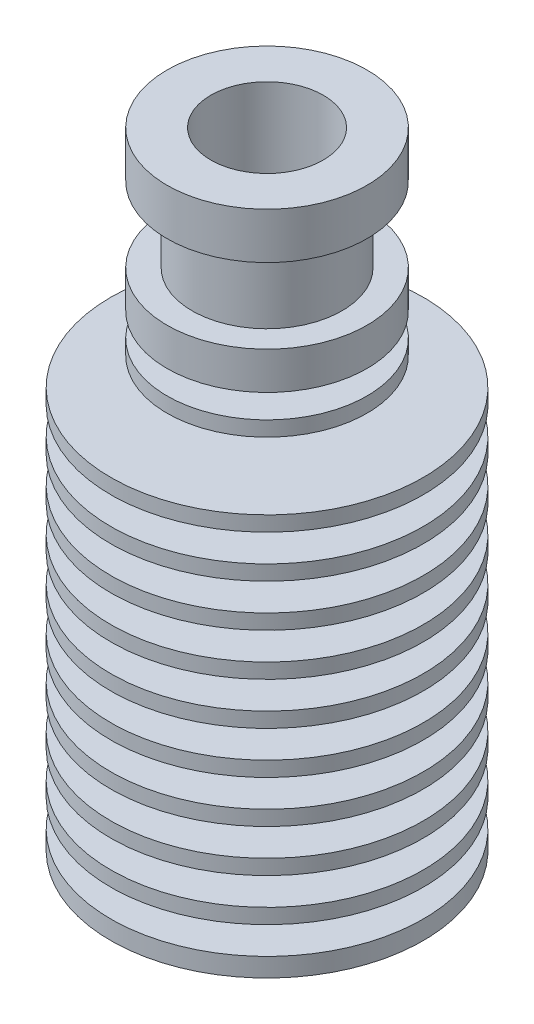
ISO-10303-21;
HEADER;
FILE_DESCRIPTION(('STEP AP214'),'2;1');
FILE_NAME('part.step','',(''),(''),'','','');
FILE_SCHEMA(('AUTOMOTIVE_DESIGN { 1 0 10303 214 1 1 1 1 }'));
ENDSEC;
DATA;
#1=APPLICATION_CONTEXT('core data for automotive mechanical design processes');
#2=APPLICATION_PROTOCOL_DEFINITION('international standard','automotive_design',2000,#1);
#3=PRODUCT_CONTEXT('',#1,'mechanical');
#4=PRODUCT('Part','Part','',(#3));
#5=PRODUCT_RELATED_PRODUCT_CATEGORY('part','',(#4));
#6=PRODUCT_DEFINITION_FORMATION('','',#4);
#7=PRODUCT_DEFINITION_CONTEXT('part definition',#1,'design');
#8=PRODUCT_DEFINITION('design','',#6,#7);
#9=PRODUCT_DEFINITION_SHAPE('','',#8);
#10=(LENGTH_UNIT() NAMED_UNIT(*) SI_UNIT(.MILLI.,.METRE.));
#11=(NAMED_UNIT(*) PLANE_ANGLE_UNIT() SI_UNIT($,.RADIAN.));
#12=(NAMED_UNIT(*) SI_UNIT($,.STERADIAN.) SOLID_ANGLE_UNIT());
#13=UNCERTAINTY_MEASURE_WITH_UNIT(LENGTH_MEASURE(1.E-05),#10,'distance_accuracy_value','');
#14=(GEOMETRIC_REPRESENTATION_CONTEXT(3) GLOBAL_UNCERTAINTY_ASSIGNED_CONTEXT((#13)) GLOBAL_UNIT_ASSIGNED_CONTEXT((#10,
#11,#12)) REPRESENTATION_CONTEXT('',''));
#15=CARTESIAN_POINT('',(0.,0.,0.));
#16=DIRECTION('',(0.,0.,1.));
#17=DIRECTION('',(1.,0.,0.));
#18=AXIS2_PLACEMENT_3D('',#15,#16,#17);
#19=CARTESIAN_POINT('',(0.,64.6374556213018,0.));
#20=DIRECTION('',(0.,1.,0.));
#21=DIRECTION('',(-1.,0.,0.));
#22=AXIS2_PLACEMENT_3D('',#19,#20,#21);
#23=CYLINDRICAL_SURFACE('',#22,8.);
#24=CARTESIAN_POINT('',(0.,54.9374556213018,0.));
#25=DIRECTION('',(0.,1.,0.));
#26=DIRECTION('',(-1.,0.,0.));
#27=AXIS2_PLACEMENT_3D('',#24,#25,#26);
#28=CIRCLE('',#27,8.);
#29=CARTESIAN_POINT('',(-8.,54.9374556213018,0.));
#30=VERTEX_POINT('',#29);
#31=EDGE_CURVE('E213',#30,#30,#28,.T.);
#32=ORIENTED_EDGE('',*,*,#31,.F.);
#33=EDGE_LOOP('',(#32));
#34=FACE_BOUND('',#33,.T.);
#35=CARTESIAN_POINT('',(0.,51.9374556213018,0.));
#36=DIRECTION('',(0.,1.,0.));
#37=DIRECTION('',(-1.,0.,0.));
#38=AXIS2_PLACEMENT_3D('',#35,#36,#37);
#39=CIRCLE('',#38,8.);
#40=CARTESIAN_POINT('',(-7.99999999999999,51.9374556213018,0.));
#41=VERTEX_POINT('',#40);
#42=EDGE_CURVE('E12',#41,#41,#39,.T.);
#43=ORIENTED_EDGE('',*,*,#42,.T.);
#44=EDGE_LOOP('',(#43));
#45=FACE_BOUND('',#44,.T.);
#46=ADVANCED_FACE('F41',(#34,#45),#23,.T.);
#47=CARTESIAN_POINT('',(8.,51.9374556213018,0.));
#48=DIRECTION('',(0.,1.,0.));
#49=DIRECTION('',(-1.,0.,0.));
#50=AXIS2_PLACEMENT_3D('',#47,#48,#49);
#51=PLANE('',#50);
#52=ORIENTED_EDGE('',*,*,#42,.F.);
#53=EDGE_LOOP('',(#52));
#54=FACE_BOUND('',#53,.T.);
#55=CARTESIAN_POINT('',(0.,51.9374556213018,0.));
#56=DIRECTION('',(0.,1.,0.));
#57=DIRECTION('',(-1.,0.,0.));
#58=AXIS2_PLACEMENT_3D('',#55,#56,#57);
#59=CIRCLE('',#58,4.5);
#60=CARTESIAN_POINT('',(-4.49999999999999,51.9374556213018,0.));
#61=VERTEX_POINT('',#60);
#62=EDGE_CURVE('E47',#61,#61,#59,.T.);
#63=ORIENTED_EDGE('',*,*,#62,.T.);
#64=EDGE_LOOP('',(#63));
#65=FACE_BOUND('',#64,.T.);
#66=ADVANCED_FACE('F220',(#54,#65),#51,.F.);
#67=CARTESIAN_POINT('',(0.,64.6374556213018,0.));
#68=DIRECTION('',(0.,1.,0.));
#69=DIRECTION('',(-1.,0.,0.));
#70=AXIS2_PLACEMENT_3D('',#67,#68,#69);
#71=CYLINDRICAL_SURFACE('',#70,4.5);
#72=ORIENTED_EDGE('',*,*,#62,.F.);
#73=EDGE_LOOP('',(#72));
#74=FACE_BOUND('',#73,.T.);
#75=CARTESIAN_POINT('',(0.,50.0374556213018,0.));
#76=DIRECTION('',(0.,1.,0.));
#77=DIRECTION('',(-1.,0.,0.));
#78=AXIS2_PLACEMENT_3D('',#75,#76,#77);
#79=CIRCLE('',#78,4.5);
#80=CARTESIAN_POINT('',(-4.49999999999999,50.0374556213018,0.));
#81=VERTEX_POINT('',#80);
#82=EDGE_CURVE('E51',#81,#81,#79,.T.);
#83=ORIENTED_EDGE('',*,*,#82,.T.);
#84=EDGE_LOOP('',(#83));
#85=FACE_BOUND('',#84,.T.);
#86=ADVANCED_FACE('F224',(#74,#85),#71,.T.);
#87=CARTESIAN_POINT('',(4.5,50.0374556213018,0.));
#88=DIRECTION('',(0.,-1.,0.));
#89=DIRECTION('',(1.,0.,0.));
#90=AXIS2_PLACEMENT_3D('',#87,#88,#89);
#91=PLANE('',#90);
#92=ORIENTED_EDGE('',*,*,#82,.F.);
#93=EDGE_LOOP('',(#92));
#94=FACE_BOUND('',#93,.T.);
#95=CARTESIAN_POINT('',(0.,50.0374556213018,0.));
#96=DIRECTION('',(0.,1.,0.));
#97=DIRECTION('',(-1.,0.,0.));
#98=AXIS2_PLACEMENT_3D('',#95,#96,#97);
#99=CIRCLE('',#98,8.);
#100=CARTESIAN_POINT('',(-7.99999999999999,50.0374556213018,0.));
#101=VERTEX_POINT('',#100);
#102=EDGE_CURVE('E55',#101,#101,#99,.T.);
#103=ORIENTED_EDGE('',*,*,#102,.T.);
#104=EDGE_LOOP('',(#103));
#105=FACE_BOUND('',#104,.T.);
#106=ADVANCED_FACE('F229',(#94,#105),#91,.F.);
#107=CARTESIAN_POINT('',(0.,64.6374556213018,0.));
#108=DIRECTION('',(0.,1.,0.));
#109=DIRECTION('',(-1.,0.,0.));
#110=AXIS2_PLACEMENT_3D('',#107,#108,#109);
#111=CYLINDRICAL_SURFACE('',#110,8.);
#112=ORIENTED_EDGE('',*,*,#102,.F.);
#113=EDGE_LOOP('',(#112));
#114=FACE_BOUND('',#113,.T.);
#115=CARTESIAN_POINT('',(0.,48.8374556213018,0.));
#116=DIRECTION('',(0.,1.,0.));
#117=DIRECTION('',(-1.,0.,0.));
#118=AXIS2_PLACEMENT_3D('',#115,#116,#117);
#119=CIRCLE('',#118,8.);
#120=CARTESIAN_POINT('',(-7.99999999999999,48.8374556213018,0.));
#121=VERTEX_POINT('',#120);
#122=EDGE_CURVE('E60',#121,#121,#119,.T.);
#123=ORIENTED_EDGE('',*,*,#122,.T.);
#124=EDGE_LOOP('',(#123));
#125=FACE_BOUND('',#124,.T.);
#126=ADVANCED_FACE('F235',(#114,#125),#111,.T.);
#127=CARTESIAN_POINT('',(8.,48.8374556213018,0.));
#128=DIRECTION('',(0.,1.,0.));
#129=DIRECTION('',(-1.,0.,0.));
#130=AXIS2_PLACEMENT_3D('',#127,#128,#129);
#131=PLANE('',#130);
#132=ORIENTED_EDGE('',*,*,#122,.F.);
#133=EDGE_LOOP('',(#132));
#134=FACE_BOUND('',#133,.T.);
#135=CARTESIAN_POINT('',(0.,48.8374556213018,0.));
#136=DIRECTION('',(0.,1.,0.));
#137=DIRECTION('',(-1.,0.,0.));
#138=AXIS2_PLACEMENT_3D('',#135,#136,#137);
#139=CIRCLE('',#138,4.);
#140=CARTESIAN_POINT('',(-4.,48.8374556213018,0.));
#141=VERTEX_POINT('',#140);
#142=EDGE_CURVE('E63',#141,#141,#139,.T.);
#143=ORIENTED_EDGE('',*,*,#142,.T.);
#144=EDGE_LOOP('',(#143));
#145=FACE_BOUND('',#144,.T.);
#146=ADVANCED_FACE('F239',(#134,#145),#131,.F.);
#147=CARTESIAN_POINT('',(0.,64.6374556213018,0.));
#148=DIRECTION('',(0.,1.,0.));
#149=DIRECTION('',(-1.,0.,0.));
#150=AXIS2_PLACEMENT_3D('',#147,#148,#149);
#151=CYLINDRICAL_SURFACE('',#150,4.);
#152=ORIENTED_EDGE('',*,*,#142,.F.);
#153=EDGE_LOOP('',(#152));
#154=FACE_BOUND('',#153,.T.);
#155=CARTESIAN_POINT('',(0.,46.6374556213018,0.));
#156=DIRECTION('',(0.,1.,0.));
#157=DIRECTION('',(-1.,0.,0.));
#158=AXIS2_PLACEMENT_3D('',#155,#156,#157);
#159=CIRCLE('',#158,4.);
#160=CARTESIAN_POINT('',(-3.99999999999999,46.6374556213018,0.));
#161=VERTEX_POINT('',#160);
#162=EDGE_CURVE('E66',#161,#161,#159,.T.);
#163=ORIENTED_EDGE('',*,*,#162,.T.);
#164=EDGE_LOOP('',(#163));
#165=FACE_BOUND('',#164,.T.);
#166=ADVANCED_FACE('F243',(#154,#165),#151,.T.);
#167=CARTESIAN_POINT('',(4.,46.6374556213018,0.));
#168=DIRECTION('',(0.,-1.,0.));
#169=DIRECTION('',(1.,0.,0.));
#170=AXIS2_PLACEMENT_3D('',#167,#168,#169);
#171=PLANE('',#170);
#172=ORIENTED_EDGE('',*,*,#162,.F.);
#173=EDGE_LOOP('',(#172));
#174=FACE_BOUND('',#173,.T.);
#175=CARTESIAN_POINT('',(0.,46.6374556213018,0.));
#176=DIRECTION('',(0.,1.,0.));
#177=DIRECTION('',(-1.,0.,0.));
#178=AXIS2_PLACEMENT_3D('',#175,#176,#177);
#179=CIRCLE('',#178,12.5);
#180=CARTESIAN_POINT('',(-12.5,46.6374556213018,0.));
#181=VERTEX_POINT('',#180);
#182=EDGE_CURVE('E69',#181,#181,#179,.T.);
#183=ORIENTED_EDGE('',*,*,#182,.T.);
#184=EDGE_LOOP('',(#183));
#185=FACE_BOUND('',#184,.T.);
#186=ADVANCED_FACE('F247',(#174,#185),#171,.F.);
#187=CARTESIAN_POINT('',(0.,64.6374556213018,0.));
#188=DIRECTION('',(0.,1.,0.));
#189=DIRECTION('',(-1.,0.,0.));
#190=AXIS2_PLACEMENT_3D('',#187,#188,#189);
#191=CYLINDRICAL_SURFACE('',#190,12.5);
#192=ORIENTED_EDGE('',*,*,#182,.F.);
#193=EDGE_LOOP('',(#192));
#194=FACE_BOUND('',#193,.T.);
#195=CARTESIAN_POINT('',(0.,45.4374556213018,0.));
#196=DIRECTION('',(0.,1.,0.));
#197=DIRECTION('',(-1.,0.,0.));
#198=AXIS2_PLACEMENT_3D('',#195,#196,#197);
#199=CIRCLE('',#198,12.5);
#200=CARTESIAN_POINT('',(-12.5,45.4374556213018,0.));
#201=VERTEX_POINT('',#200);
#202=EDGE_CURVE('E72',#201,#201,#199,.T.);
#203=ORIENTED_EDGE('',*,*,#202,.T.);
#204=EDGE_LOOP('',(#203));
#205=FACE_BOUND('',#204,.T.);
#206=ADVANCED_FACE('F251',(#194,#205),#191,.T.);
#207=CARTESIAN_POINT('',(12.5,45.4374556213018,0.));
#208=DIRECTION('',(0.,1.,0.));
#209=DIRECTION('',(-1.,0.,0.));
#210=AXIS2_PLACEMENT_3D('',#207,#208,#209);
#211=PLANE('',#210);
#212=ORIENTED_EDGE('',*,*,#202,.F.);
#213=EDGE_LOOP('',(#212));
#214=FACE_BOUND('',#213,.T.);
#215=CARTESIAN_POINT('',(0.,45.4374556213018,0.));
#216=DIRECTION('',(0.,1.,0.));
#217=DIRECTION('',(-1.,0.,0.));
#218=AXIS2_PLACEMENT_3D('',#215,#216,#217);
#219=CIRCLE('',#218,4.);
#220=CARTESIAN_POINT('',(-3.99999999999999,45.4374556213018,0.));
#221=VERTEX_POINT('',#220);
#222=EDGE_CURVE('E75',#221,#221,#219,.T.);
#223=ORIENTED_EDGE('',*,*,#222,.T.);
#224=EDGE_LOOP('',(#223));
#225=FACE_BOUND('',#224,.T.);
#226=ADVANCED_FACE('F255',(#214,#225),#211,.F.);
#227=CARTESIAN_POINT('',(0.,64.6374556213018,0.));
#228=DIRECTION('',(0.,1.,0.));
#229=DIRECTION('',(-1.,0.,0.));
#230=AXIS2_PLACEMENT_3D('',#227,#228,#229);
#231=CYLINDRICAL_SURFACE('',#230,4.);
#232=ORIENTED_EDGE('',*,*,#222,.F.);
#233=EDGE_LOOP('',(#232));
#234=FACE_BOUND('',#233,.T.);
#235=CARTESIAN_POINT('',(0.,43.2374556213018,0.));
#236=DIRECTION('',(0.,1.,0.));
#237=DIRECTION('',(-1.,0.,0.));
#238=AXIS2_PLACEMENT_3D('',#235,#236,#237);
#239=CIRCLE('',#238,4.);
#240=CARTESIAN_POINT('',(-3.99999999999999,43.2374556213018,0.));
#241=VERTEX_POINT('',#240);
#242=EDGE_CURVE('E78',#241,#241,#239,.T.);
#243=ORIENTED_EDGE('',*,*,#242,.T.);
#244=EDGE_LOOP('',(#243));
#245=FACE_BOUND('',#244,.T.);
#246=ADVANCED_FACE('F259',(#234,#245),#231,.T.);
#247=CARTESIAN_POINT('',(4.,43.2374556213018,0.));
#248=DIRECTION('',(0.,-1.,0.));
#249=DIRECTION('',(1.,0.,0.));
#250=AXIS2_PLACEMENT_3D('',#247,#248,#249);
#251=PLANE('',#250);
#252=ORIENTED_EDGE('',*,*,#242,.F.);
#253=EDGE_LOOP('',(#252));
#254=FACE_BOUND('',#253,.T.);
#255=CARTESIAN_POINT('',(0.,43.2374556213018,0.));
#256=DIRECTION('',(0.,1.,0.));
#257=DIRECTION('',(-1.,0.,0.));
#258=AXIS2_PLACEMENT_3D('',#255,#256,#257);
#259=CIRCLE('',#258,12.5);
#260=CARTESIAN_POINT('',(-12.5,43.2374556213018,0.));
#261=VERTEX_POINT('',#260);
#262=EDGE_CURVE('E81',#261,#261,#259,.T.);
#263=ORIENTED_EDGE('',*,*,#262,.T.);
#264=EDGE_LOOP('',(#263));
#265=FACE_BOUND('',#264,.T.);
#266=ADVANCED_FACE('F263',(#254,#265),#251,.F.);
#267=CARTESIAN_POINT('',(0.,64.6374556213018,0.));
#268=DIRECTION('',(0.,1.,0.));
#269=DIRECTION('',(-1.,0.,0.));
#270=AXIS2_PLACEMENT_3D('',#267,#268,#269);
#271=CYLINDRICAL_SURFACE('',#270,12.5);
#272=ORIENTED_EDGE('',*,*,#262,.F.);
#273=EDGE_LOOP('',(#272));
#274=FACE_BOUND('',#273,.T.);
#275=CARTESIAN_POINT('',(0.,42.0374556213018,0.));
#276=DIRECTION('',(0.,1.,0.));
#277=DIRECTION('',(-1.,0.,0.));
#278=AXIS2_PLACEMENT_3D('',#275,#276,#277);
#279=CIRCLE('',#278,12.5);
#280=CARTESIAN_POINT('',(-12.5,42.0374556213018,0.));
#281=VERTEX_POINT('',#280);
#282=EDGE_CURVE('E84',#281,#281,#279,.T.);
#283=ORIENTED_EDGE('',*,*,#282,.T.);
#284=EDGE_LOOP('',(#283));
#285=FACE_BOUND('',#284,.T.);
#286=ADVANCED_FACE('F267',(#274,#285),#271,.T.);
#287=CARTESIAN_POINT('',(12.5,42.0374556213018,0.));
#288=DIRECTION('',(0.,1.,0.));
#289=DIRECTION('',(-1.,0.,0.));
#290=AXIS2_PLACEMENT_3D('',#287,#288,#289);
#291=PLANE('',#290);
#292=ORIENTED_EDGE('',*,*,#282,.F.);
#293=EDGE_LOOP('',(#292));
#294=FACE_BOUND('',#293,.T.);
#295=CARTESIAN_POINT('',(0.,42.0374556213018,0.));
#296=DIRECTION('',(0.,1.,0.));
#297=DIRECTION('',(-1.,0.,0.));
#298=AXIS2_PLACEMENT_3D('',#295,#296,#297);
#299=CIRCLE('',#298,4.);
#300=CARTESIAN_POINT('',(-3.99999999999999,42.0374556213018,0.));
#301=VERTEX_POINT('',#300);
#302=EDGE_CURVE('E87',#301,#301,#299,.T.);
#303=ORIENTED_EDGE('',*,*,#302,.T.);
#304=EDGE_LOOP('',(#303));
#305=FACE_BOUND('',#304,.T.);
#306=ADVANCED_FACE('F271',(#294,#305),#291,.F.);
#307=CARTESIAN_POINT('',(0.,64.6374556213018,0.));
#308=DIRECTION('',(0.,1.,0.));
#309=DIRECTION('',(-1.,0.,0.));
#310=AXIS2_PLACEMENT_3D('',#307,#308,#309);
#311=CYLINDRICAL_SURFACE('',#310,4.);
#312=ORIENTED_EDGE('',*,*,#302,.F.);
#313=EDGE_LOOP('',(#312));
#314=FACE_BOUND('',#313,.T.);
#315=CARTESIAN_POINT('',(0.,39.8374556213018,0.));
#316=DIRECTION('',(0.,1.,0.));
#317=DIRECTION('',(-1.,0.,0.));
#318=AXIS2_PLACEMENT_3D('',#315,#316,#317);
#319=CIRCLE('',#318,4.);
#320=CARTESIAN_POINT('',(-3.99999999999999,39.8374556213018,0.));
#321=VERTEX_POINT('',#320);
#322=EDGE_CURVE('E90',#321,#321,#319,.T.);
#323=ORIENTED_EDGE('',*,*,#322,.T.);
#324=EDGE_LOOP('',(#323));
#325=FACE_BOUND('',#324,.T.);
#326=ADVANCED_FACE('F275',(#314,#325),#311,.T.);
#327=CARTESIAN_POINT('',(4.,39.8374556213018,0.));
#328=DIRECTION('',(0.,-1.,0.));
#329=DIRECTION('',(1.,0.,0.));
#330=AXIS2_PLACEMENT_3D('',#327,#328,#329);
#331=PLANE('',#330);
#332=ORIENTED_EDGE('',*,*,#322,.F.);
#333=EDGE_LOOP('',(#332));
#334=FACE_BOUND('',#333,.T.);
#335=CARTESIAN_POINT('',(0.,39.8374556213018,0.));
#336=DIRECTION('',(0.,1.,0.));
#337=DIRECTION('',(-1.,0.,0.));
#338=AXIS2_PLACEMENT_3D('',#335,#336,#337);
#339=CIRCLE('',#338,12.5);
#340=CARTESIAN_POINT('',(-12.5,39.8374556213018,0.));
#341=VERTEX_POINT('',#340);
#342=EDGE_CURVE('E93',#341,#341,#339,.T.);
#343=ORIENTED_EDGE('',*,*,#342,.T.);
#344=EDGE_LOOP('',(#343));
#345=FACE_BOUND('',#344,.T.);
#346=ADVANCED_FACE('F279',(#334,#345),#331,.F.);
#347=CARTESIAN_POINT('',(0.,64.6374556213018,0.));
#348=DIRECTION('',(0.,1.,0.));
#349=DIRECTION('',(-1.,0.,0.));
#350=AXIS2_PLACEMENT_3D('',#347,#348,#349);
#351=CYLINDRICAL_SURFACE('',#350,12.5);
#352=ORIENTED_EDGE('',*,*,#342,.F.);
#353=EDGE_LOOP('',(#352));
#354=FACE_BOUND('',#353,.T.);
#355=CARTESIAN_POINT('',(0.,38.6374556213018,0.));
#356=DIRECTION('',(0.,1.,0.));
#357=DIRECTION('',(-1.,0.,0.));
#358=AXIS2_PLACEMENT_3D('',#355,#356,#357);
#359=CIRCLE('',#358,12.5);
#360=CARTESIAN_POINT('',(-12.5,38.6374556213018,0.));
#361=VERTEX_POINT('',#360);
#362=EDGE_CURVE('E96',#361,#361,#359,.T.);
#363=ORIENTED_EDGE('',*,*,#362,.T.);
#364=EDGE_LOOP('',(#363));
#365=FACE_BOUND('',#364,.T.);
#366=ADVANCED_FACE('F283',(#354,#365),#351,.T.);
#367=CARTESIAN_POINT('',(12.5,38.6374556213018,0.));
#368=DIRECTION('',(0.,1.,0.));
#369=DIRECTION('',(-1.,0.,0.));
#370=AXIS2_PLACEMENT_3D('',#367,#368,#369);
#371=PLANE('',#370);
#372=ORIENTED_EDGE('',*,*,#362,.F.);
#373=EDGE_LOOP('',(#372));
#374=FACE_BOUND('',#373,.T.);
#375=CARTESIAN_POINT('',(0.,38.6374556213018,0.));
#376=DIRECTION('',(0.,1.,0.));
#377=DIRECTION('',(-1.,0.,0.));
#378=AXIS2_PLACEMENT_3D('',#375,#376,#377);
#379=CIRCLE('',#378,4.);
#380=CARTESIAN_POINT('',(-3.99999999999999,38.6374556213018,0.));
#381=VERTEX_POINT('',#380);
#382=EDGE_CURVE('E99',#381,#381,#379,.T.);
#383=ORIENTED_EDGE('',*,*,#382,.T.);
#384=EDGE_LOOP('',(#383));
#385=FACE_BOUND('',#384,.T.);
#386=ADVANCED_FACE('F287',(#374,#385),#371,.F.);
#387=CARTESIAN_POINT('',(0.,64.6374556213018,0.));
#388=DIRECTION('',(0.,1.,0.));
#389=DIRECTION('',(-1.,0.,0.));
#390=AXIS2_PLACEMENT_3D('',#387,#388,#389);
#391=CYLINDRICAL_SURFACE('',#390,4.);
#392=ORIENTED_EDGE('',*,*,#382,.F.);
#393=EDGE_LOOP('',(#392));
#394=FACE_BOUND('',#393,.T.);
#395=CARTESIAN_POINT('',(0.,36.4374556213018,0.));
#396=DIRECTION('',(0.,1.,0.));
#397=DIRECTION('',(-1.,0.,0.));
#398=AXIS2_PLACEMENT_3D('',#395,#396,#397);
#399=CIRCLE('',#398,4.);
#400=CARTESIAN_POINT('',(-3.99999999999999,36.4374556213018,0.));
#401=VERTEX_POINT('',#400);
#402=EDGE_CURVE('E102',#401,#401,#399,.T.);
#403=ORIENTED_EDGE('',*,*,#402,.T.);
#404=EDGE_LOOP('',(#403));
#405=FACE_BOUND('',#404,.T.);
#406=ADVANCED_FACE('F291',(#394,#405),#391,.T.);
#407=CARTESIAN_POINT('',(4.,36.4374556213018,0.));
#408=DIRECTION('',(0.,-1.,0.));
#409=DIRECTION('',(1.,0.,0.));
#410=AXIS2_PLACEMENT_3D('',#407,#408,#409);
#411=PLANE('',#410);
#412=ORIENTED_EDGE('',*,*,#402,.F.);
#413=EDGE_LOOP('',(#412));
#414=FACE_BOUND('',#413,.T.);
#415=CARTESIAN_POINT('',(0.,36.4374556213018,0.));
#416=DIRECTION('',(0.,1.,0.));
#417=DIRECTION('',(-1.,0.,0.));
#418=AXIS2_PLACEMENT_3D('',#415,#416,#417);
#419=CIRCLE('',#418,12.5);
#420=CARTESIAN_POINT('',(-12.5,36.4374556213018,0.));
#421=VERTEX_POINT('',#420);
#422=EDGE_CURVE('E105',#421,#421,#419,.T.);
#423=ORIENTED_EDGE('',*,*,#422,.T.);
#424=EDGE_LOOP('',(#423));
#425=FACE_BOUND('',#424,.T.);
#426=ADVANCED_FACE('F295',(#414,#425),#411,.F.);
#427=CARTESIAN_POINT('',(0.,64.6374556213018,0.));
#428=DIRECTION('',(0.,1.,0.));
#429=DIRECTION('',(-1.,0.,0.));
#430=AXIS2_PLACEMENT_3D('',#427,#428,#429);
#431=CYLINDRICAL_SURFACE('',#430,12.5);
#432=ORIENTED_EDGE('',*,*,#422,.F.);
#433=EDGE_LOOP('',(#432));
#434=FACE_BOUND('',#433,.T.);
#435=CARTESIAN_POINT('',(0.,35.2374556213018,0.));
#436=DIRECTION('',(0.,1.,0.));
#437=DIRECTION('',(-1.,0.,0.));
#438=AXIS2_PLACEMENT_3D('',#435,#436,#437);
#439=CIRCLE('',#438,12.5);
#440=CARTESIAN_POINT('',(-12.5,35.2374556213018,0.));
#441=VERTEX_POINT('',#440);
#442=EDGE_CURVE('E108',#441,#441,#439,.T.);
#443=ORIENTED_EDGE('',*,*,#442,.T.);
#444=EDGE_LOOP('',(#443));
#445=FACE_BOUND('',#444,.T.);
#446=ADVANCED_FACE('F299',(#434,#445),#431,.T.);
#447=CARTESIAN_POINT('',(12.5,35.2374556213018,0.));
#448=DIRECTION('',(0.,1.,0.));
#449=DIRECTION('',(-1.,0.,0.));
#450=AXIS2_PLACEMENT_3D('',#447,#448,#449);
#451=PLANE('',#450);
#452=ORIENTED_EDGE('',*,*,#442,.F.);
#453=EDGE_LOOP('',(#452));
#454=FACE_BOUND('',#453,.T.);
#455=CARTESIAN_POINT('',(0.,35.2374556213018,0.));
#456=DIRECTION('',(0.,1.,0.));
#457=DIRECTION('',(-1.,0.,0.));
#458=AXIS2_PLACEMENT_3D('',#455,#456,#457);
#459=CIRCLE('',#458,6.5);
#460=CARTESIAN_POINT('',(-6.49999999999999,35.2374556213018,0.));
#461=VERTEX_POINT('',#460);
#462=EDGE_CURVE('E111',#461,#461,#459,.T.);
#463=ORIENTED_EDGE('',*,*,#462,.T.);
#464=EDGE_LOOP('',(#463));
#465=FACE_BOUND('',#464,.T.);
#466=ADVANCED_FACE('F303',(#454,#465),#451,.F.);
#467=CARTESIAN_POINT('',(0.,64.6374556213018,0.));
#468=DIRECTION('',(0.,1.,0.));
#469=DIRECTION('',(-1.,0.,0.));
#470=AXIS2_PLACEMENT_3D('',#467,#468,#469);
#471=CYLINDRICAL_SURFACE('',#470,6.5);
#472=ORIENTED_EDGE('',*,*,#462,.F.);
#473=EDGE_LOOP('',(#472));
#474=FACE_BOUND('',#473,.T.);
#475=CARTESIAN_POINT('',(0.,33.0374556213018,0.));
#476=DIRECTION('',(0.,1.,0.));
#477=DIRECTION('',(-1.,0.,0.));
#478=AXIS2_PLACEMENT_3D('',#475,#476,#477);
#479=CIRCLE('',#478,6.5);
#480=CARTESIAN_POINT('',(-6.49999999999999,33.0374556213018,0.));
#481=VERTEX_POINT('',#480);
#482=EDGE_CURVE('E114',#481,#481,#479,.T.);
#483=ORIENTED_EDGE('',*,*,#482,.T.);
#484=EDGE_LOOP('',(#483));
#485=FACE_BOUND('',#484,.T.);
#486=ADVANCED_FACE('F307',(#474,#485),#471,.T.);
#487=CARTESIAN_POINT('',(6.5,33.0374556213018,0.));
#488=DIRECTION('',(0.,-1.,0.));
#489=DIRECTION('',(1.,0.,0.));
#490=AXIS2_PLACEMENT_3D('',#487,#488,#489);
#491=PLANE('',#490);
#492=ORIENTED_EDGE('',*,*,#482,.F.);
#493=EDGE_LOOP('',(#492));
#494=FACE_BOUND('',#493,.T.);
#495=CARTESIAN_POINT('',(0.,33.0374556213018,0.));
#496=DIRECTION('',(0.,1.,0.));
#497=DIRECTION('',(-1.,0.,0.));
#498=AXIS2_PLACEMENT_3D('',#495,#496,#497);
#499=CIRCLE('',#498,12.5);
#500=CARTESIAN_POINT('',(-12.5,33.0374556213018,0.));
#501=VERTEX_POINT('',#500);
#502=EDGE_CURVE('E117',#501,#501,#499,.T.);
#503=ORIENTED_EDGE('',*,*,#502,.T.);
#504=EDGE_LOOP('',(#503));
#505=FACE_BOUND('',#504,.T.);
#506=ADVANCED_FACE('F311',(#494,#505),#491,.F.);
#507=CARTESIAN_POINT('',(0.,64.6374556213018,0.));
#508=DIRECTION('',(0.,1.,0.));
#509=DIRECTION('',(-1.,0.,0.));
#510=AXIS2_PLACEMENT_3D('',#507,#508,#509);
#511=CYLINDRICAL_SURFACE('',#510,12.5);
#512=ORIENTED_EDGE('',*,*,#502,.F.);
#513=EDGE_LOOP('',(#512));
#514=FACE_BOUND('',#513,.T.);
#515=CARTESIAN_POINT('',(0.,31.8374556213018,0.));
#516=DIRECTION('',(0.,1.,0.));
#517=DIRECTION('',(-1.,0.,0.));
#518=AXIS2_PLACEMENT_3D('',#515,#516,#517);
#519=CIRCLE('',#518,12.5);
#520=CARTESIAN_POINT('',(-12.5,31.8374556213018,0.));
#521=VERTEX_POINT('',#520);
#522=EDGE_CURVE('E120',#521,#521,#519,.T.);
#523=ORIENTED_EDGE('',*,*,#522,.T.);
#524=EDGE_LOOP('',(#523));
#525=FACE_BOUND('',#524,.T.);
#526=ADVANCED_FACE('F315',(#514,#525),#511,.T.);
#527=CARTESIAN_POINT('',(12.5,31.8374556213018,0.));
#528=DIRECTION('',(0.,1.,0.));
#529=DIRECTION('',(-1.,0.,0.));
#530=AXIS2_PLACEMENT_3D('',#527,#528,#529);
#531=PLANE('',#530);
#532=ORIENTED_EDGE('',*,*,#522,.F.);
#533=EDGE_LOOP('',(#532));
#534=FACE_BOUND('',#533,.T.);
#535=CARTESIAN_POINT('',(0.,31.8374556213018,0.));
#536=DIRECTION('',(0.,1.,0.));
#537=DIRECTION('',(-1.,0.,0.));
#538=AXIS2_PLACEMENT_3D('',#535,#536,#537);
#539=CIRCLE('',#538,7.5);
#540=CARTESIAN_POINT('',(-7.49999999999999,31.8374556213018,0.));
#541=VERTEX_POINT('',#540);
#542=EDGE_CURVE('E123',#541,#541,#539,.T.);
#543=ORIENTED_EDGE('',*,*,#542,.T.);
#544=EDGE_LOOP('',(#543));
#545=FACE_BOUND('',#544,.T.);
#546=ADVANCED_FACE('F319',(#534,#545),#531,.F.);
#547=CARTESIAN_POINT('',(0.,64.6374556213018,0.));
#548=DIRECTION('',(0.,1.,0.));
#549=DIRECTION('',(-1.,0.,0.));
#550=AXIS2_PLACEMENT_3D('',#547,#548,#549);
#551=CYLINDRICAL_SURFACE('',#550,7.5);
#552=ORIENTED_EDGE('',*,*,#542,.F.);
#553=EDGE_LOOP('',(#552));
#554=FACE_BOUND('',#553,.T.);
#555=CARTESIAN_POINT('',(0.,29.6374556213018,0.));
#556=DIRECTION('',(0.,1.,0.));
#557=DIRECTION('',(-1.,0.,0.));
#558=AXIS2_PLACEMENT_3D('',#555,#556,#557);
#559=CIRCLE('',#558,7.5);
#560=CARTESIAN_POINT('',(-7.49999999999999,29.6374556213018,0.));
#561=VERTEX_POINT('',#560);
#562=EDGE_CURVE('E126',#561,#561,#559,.T.);
#563=ORIENTED_EDGE('',*,*,#562,.T.);
#564=EDGE_LOOP('',(#563));
#565=FACE_BOUND('',#564,.T.);
#566=ADVANCED_FACE('F323',(#554,#565),#551,.T.);
#567=CARTESIAN_POINT('',(7.5,29.6374556213018,0.));
#568=DIRECTION('',(0.,-1.,0.));
#569=DIRECTION('',(1.,0.,0.));
#570=AXIS2_PLACEMENT_3D('',#567,#568,#569);
#571=PLANE('',#570);
#572=ORIENTED_EDGE('',*,*,#562,.F.);
#573=EDGE_LOOP('',(#572));
#574=FACE_BOUND('',#573,.T.);
#575=CARTESIAN_POINT('',(0.,29.6374556213018,0.));
#576=DIRECTION('',(0.,1.,0.));
#577=DIRECTION('',(-1.,0.,0.));
#578=AXIS2_PLACEMENT_3D('',#575,#576,#577);
#579=CIRCLE('',#578,12.5);
#580=CARTESIAN_POINT('',(-12.5,29.6374556213018,0.));
#581=VERTEX_POINT('',#580);
#582=EDGE_CURVE('E129',#581,#581,#579,.T.);
#583=ORIENTED_EDGE('',*,*,#582,.T.);
#584=EDGE_LOOP('',(#583));
#585=FACE_BOUND('',#584,.T.);
#586=ADVANCED_FACE('F327',(#574,#585),#571,.F.);
#587=CARTESIAN_POINT('',(0.,64.6374556213018,0.));
#588=DIRECTION('',(0.,1.,0.));
#589=DIRECTION('',(-1.,0.,0.));
#590=AXIS2_PLACEMENT_3D('',#587,#588,#589);
#591=CYLINDRICAL_SURFACE('',#590,12.5);
#592=ORIENTED_EDGE('',*,*,#582,.F.);
#593=EDGE_LOOP('',(#592));
#594=FACE_BOUND('',#593,.T.);
#595=CARTESIAN_POINT('',(0.,28.4374556213018,0.));
#596=DIRECTION('',(0.,1.,0.));
#597=DIRECTION('',(-1.,0.,0.));
#598=AXIS2_PLACEMENT_3D('',#595,#596,#597);
#599=CIRCLE('',#598,12.5);
#600=CARTESIAN_POINT('',(-12.5,28.4374556213018,0.));
#601=VERTEX_POINT('',#600);
#602=EDGE_CURVE('E132',#601,#601,#599,.T.);
#603=ORIENTED_EDGE('',*,*,#602,.T.);
#604=EDGE_LOOP('',(#603));
#605=FACE_BOUND('',#604,.T.);
#606=ADVANCED_FACE('F331',(#594,#605),#591,.T.);
#607=CARTESIAN_POINT('',(12.5,28.4374556213018,0.));
#608=DIRECTION('',(0.,1.,0.));
#609=DIRECTION('',(-1.,0.,0.));
#610=AXIS2_PLACEMENT_3D('',#607,#608,#609);
#611=PLANE('',#610);
#612=ORIENTED_EDGE('',*,*,#602,.F.);
#613=EDGE_LOOP('',(#612));
#614=FACE_BOUND('',#613,.T.);
#615=CARTESIAN_POINT('',(0.,28.4374556213018,0.));
#616=DIRECTION('',(0.,1.,0.));
#617=DIRECTION('',(-1.,0.,0.));
#618=AXIS2_PLACEMENT_3D('',#615,#616,#617);
#619=CIRCLE('',#618,7.5);
#620=CARTESIAN_POINT('',(-7.49999999999999,28.4374556213018,0.));
#621=VERTEX_POINT('',#620);
#622=EDGE_CURVE('E135',#621,#621,#619,.T.);
#623=ORIENTED_EDGE('',*,*,#622,.T.);
#624=EDGE_LOOP('',(#623));
#625=FACE_BOUND('',#624,.T.);
#626=ADVANCED_FACE('F335',(#614,#625),#611,.F.);
#627=CARTESIAN_POINT('',(0.,64.6374556213018,0.));
#628=DIRECTION('',(0.,1.,0.));
#629=DIRECTION('',(-1.,0.,0.));
#630=AXIS2_PLACEMENT_3D('',#627,#628,#629);
#631=CYLINDRICAL_SURFACE('',#630,7.5);
#632=ORIENTED_EDGE('',*,*,#622,.F.);
#633=EDGE_LOOP('',(#632));
#634=FACE_BOUND('',#633,.T.);
#635=CARTESIAN_POINT('',(0.,26.2374556213018,0.));
#636=DIRECTION('',(0.,1.,0.));
#637=DIRECTION('',(-1.,0.,0.));
#638=AXIS2_PLACEMENT_3D('',#635,#636,#637);
#639=CIRCLE('',#638,7.5);
#640=CARTESIAN_POINT('',(-7.49999999999999,26.2374556213018,0.));
#641=VERTEX_POINT('',#640);
#642=EDGE_CURVE('E138',#641,#641,#639,.T.);
#643=ORIENTED_EDGE('',*,*,#642,.T.);
#644=EDGE_LOOP('',(#643));
#645=FACE_BOUND('',#644,.T.);
#646=ADVANCED_FACE('F339',(#634,#645),#631,.T.);
#647=CARTESIAN_POINT('',(7.5,26.2374556213018,0.));
#648=DIRECTION('',(0.,-1.,0.));
#649=DIRECTION('',(1.,0.,0.));
#650=AXIS2_PLACEMENT_3D('',#647,#648,#649);
#651=PLANE('',#650);
#652=ORIENTED_EDGE('',*,*,#642,.F.);
#653=EDGE_LOOP('',(#652));
#654=FACE_BOUND('',#653,.T.);
#655=CARTESIAN_POINT('',(0.,26.2374556213018,0.));
#656=DIRECTION('',(0.,1.,0.));
#657=DIRECTION('',(-1.,0.,0.));
#658=AXIS2_PLACEMENT_3D('',#655,#656,#657);
#659=CIRCLE('',#658,12.5);
#660=CARTESIAN_POINT('',(-12.5,26.2374556213018,0.));
#661=VERTEX_POINT('',#660);
#662=EDGE_CURVE('E141',#661,#661,#659,.T.);
#663=ORIENTED_EDGE('',*,*,#662,.T.);
#664=EDGE_LOOP('',(#663));
#665=FACE_BOUND('',#664,.T.);
#666=ADVANCED_FACE('F343',(#654,#665),#651,.F.);
#667=CARTESIAN_POINT('',(0.,64.6374556213018,0.));
#668=DIRECTION('',(0.,1.,0.));
#669=DIRECTION('',(-1.,0.,0.));
#670=AXIS2_PLACEMENT_3D('',#667,#668,#669);
#671=CYLINDRICAL_SURFACE('',#670,12.5);
#672=ORIENTED_EDGE('',*,*,#662,.F.);
#673=EDGE_LOOP('',(#672));
#674=FACE_BOUND('',#673,.T.);
#675=CARTESIAN_POINT('',(0.,25.0374556213018,0.));
#676=DIRECTION('',(0.,1.,0.));
#677=DIRECTION('',(-1.,0.,0.));
#678=AXIS2_PLACEMENT_3D('',#675,#676,#677);
#679=CIRCLE('',#678,12.5);
#680=CARTESIAN_POINT('',(-12.5,25.0374556213018,0.));
#681=VERTEX_POINT('',#680);
#682=EDGE_CURVE('E144',#681,#681,#679,.T.);
#683=ORIENTED_EDGE('',*,*,#682,.T.);
#684=EDGE_LOOP('',(#683));
#685=FACE_BOUND('',#684,.T.);
#686=ADVANCED_FACE('F347',(#674,#685),#671,.T.);
#687=CARTESIAN_POINT('',(12.5,25.0374556213018,0.));
#688=DIRECTION('',(0.,1.,0.));
#689=DIRECTION('',(-1.,0.,0.));
#690=AXIS2_PLACEMENT_3D('',#687,#688,#689);
#691=PLANE('',#690);
#692=ORIENTED_EDGE('',*,*,#682,.F.);
#693=EDGE_LOOP('',(#692));
#694=FACE_BOUND('',#693,.T.);
#695=CARTESIAN_POINT('',(0.,25.0374556213018,0.));
#696=DIRECTION('',(0.,1.,0.));
#697=DIRECTION('',(-1.,0.,0.));
#698=AXIS2_PLACEMENT_3D('',#695,#696,#697);
#699=CIRCLE('',#698,7.5);
#700=CARTESIAN_POINT('',(-7.49999999999999,25.0374556213018,0.));
#701=VERTEX_POINT('',#700);
#702=EDGE_CURVE('E147',#701,#701,#699,.T.);
#703=ORIENTED_EDGE('',*,*,#702,.T.);
#704=EDGE_LOOP('',(#703));
#705=FACE_BOUND('',#704,.T.);
#706=ADVANCED_FACE('F351',(#694,#705),#691,.F.);
#707=CARTESIAN_POINT('',(0.,64.6374556213018,0.));
#708=DIRECTION('',(0.,1.,0.));
#709=DIRECTION('',(-1.,0.,0.));
#710=AXIS2_PLACEMENT_3D('',#707,#708,#709);
#711=CYLINDRICAL_SURFACE('',#710,7.5);
#712=ORIENTED_EDGE('',*,*,#702,.F.);
#713=EDGE_LOOP('',(#712));
#714=FACE_BOUND('',#713,.T.);
#715=CARTESIAN_POINT('',(0.,22.8374556213018,0.));
#716=DIRECTION('',(0.,1.,0.));
#717=DIRECTION('',(-1.,0.,0.));
#718=AXIS2_PLACEMENT_3D('',#715,#716,#717);
#719=CIRCLE('',#718,7.5);
#720=CARTESIAN_POINT('',(-7.49999999999999,22.8374556213018,0.));
#721=VERTEX_POINT('',#720);
#722=EDGE_CURVE('E150',#721,#721,#719,.T.);
#723=ORIENTED_EDGE('',*,*,#722,.T.);
#724=EDGE_LOOP('',(#723));
#725=FACE_BOUND('',#724,.T.);
#726=ADVANCED_FACE('F355',(#714,#725),#711,.T.);
#727=CARTESIAN_POINT('',(7.5,22.8374556213018,0.));
#728=DIRECTION('',(0.,-1.,0.));
#729=DIRECTION('',(1.,0.,0.));
#730=AXIS2_PLACEMENT_3D('',#727,#728,#729);
#731=PLANE('',#730);
#732=ORIENTED_EDGE('',*,*,#722,.F.);
#733=EDGE_LOOP('',(#732));
#734=FACE_BOUND('',#733,.T.);
#735=CARTESIAN_POINT('',(0.,22.8374556213018,0.));
#736=DIRECTION('',(0.,1.,0.));
#737=DIRECTION('',(-1.,0.,0.));
#738=AXIS2_PLACEMENT_3D('',#735,#736,#737);
#739=CIRCLE('',#738,12.5);
#740=CARTESIAN_POINT('',(-12.5,22.8374556213018,0.));
#741=VERTEX_POINT('',#740);
#742=EDGE_CURVE('E153',#741,#741,#739,.T.);
#743=ORIENTED_EDGE('',*,*,#742,.T.);
#744=EDGE_LOOP('',(#743));
#745=FACE_BOUND('',#744,.T.);
#746=ADVANCED_FACE('F359',(#734,#745),#731,.F.);
#747=CARTESIAN_POINT('',(0.,64.6374556213018,0.));
#748=DIRECTION('',(0.,1.,0.));
#749=DIRECTION('',(-1.,0.,0.));
#750=AXIS2_PLACEMENT_3D('',#747,#748,#749);
#751=CYLINDRICAL_SURFACE('',#750,12.5);
#752=ORIENTED_EDGE('',*,*,#742,.F.);
#753=EDGE_LOOP('',(#752));
#754=FACE_BOUND('',#753,.T.);
#755=CARTESIAN_POINT('',(0.,21.6374556213018,0.));
#756=DIRECTION('',(0.,1.,0.));
#757=DIRECTION('',(-1.,0.,0.));
#758=AXIS2_PLACEMENT_3D('',#755,#756,#757);
#759=CIRCLE('',#758,12.5);
#760=CARTESIAN_POINT('',(-12.5,21.6374556213018,0.));
#761=VERTEX_POINT('',#760);
#762=EDGE_CURVE('E156',#761,#761,#759,.T.);
#763=ORIENTED_EDGE('',*,*,#762,.T.);
#764=EDGE_LOOP('',(#763));
#765=FACE_BOUND('',#764,.T.);
#766=ADVANCED_FACE('F363',(#754,#765),#751,.T.);
#767=CARTESIAN_POINT('',(12.5,21.6374556213018,0.));
#768=DIRECTION('',(0.,1.,0.));
#769=DIRECTION('',(-1.,0.,0.));
#770=AXIS2_PLACEMENT_3D('',#767,#768,#769);
#771=PLANE('',#770);
#772=ORIENTED_EDGE('',*,*,#762,.F.);
#773=EDGE_LOOP('',(#772));
#774=FACE_BOUND('',#773,.T.);
#775=CARTESIAN_POINT('',(0.,21.6374556213018,0.));
#776=DIRECTION('',(0.,1.,0.));
#777=DIRECTION('',(-1.,0.,0.));
#778=AXIS2_PLACEMENT_3D('',#775,#776,#777);
#779=CIRCLE('',#778,7.5);
#780=CARTESIAN_POINT('',(-7.49999999999999,21.6374556213018,0.));
#781=VERTEX_POINT('',#780);
#782=EDGE_CURVE('E159',#781,#781,#779,.T.);
#783=ORIENTED_EDGE('',*,*,#782,.T.);
#784=EDGE_LOOP('',(#783));
#785=FACE_BOUND('',#784,.T.);
#786=ADVANCED_FACE('F367',(#774,#785),#771,.F.);
#787=CARTESIAN_POINT('',(0.,64.6374556213018,0.));
#788=DIRECTION('',(0.,1.,0.));
#789=DIRECTION('',(-1.,0.,0.));
#790=AXIS2_PLACEMENT_3D('',#787,#788,#789);
#791=CYLINDRICAL_SURFACE('',#790,7.5);
#792=ORIENTED_EDGE('',*,*,#782,.F.);
#793=EDGE_LOOP('',(#792));
#794=FACE_BOUND('',#793,.T.);
#795=CARTESIAN_POINT('',(0.,19.4374556213018,0.));
#796=DIRECTION('',(0.,1.,0.));
#797=DIRECTION('',(-1.,0.,0.));
#798=AXIS2_PLACEMENT_3D('',#795,#796,#797);
#799=CIRCLE('',#798,7.5);
#800=CARTESIAN_POINT('',(-7.49999999999999,19.4374556213018,0.));
#801=VERTEX_POINT('',#800);
#802=EDGE_CURVE('E162',#801,#801,#799,.T.);
#803=ORIENTED_EDGE('',*,*,#802,.T.);
#804=EDGE_LOOP('',(#803));
#805=FACE_BOUND('',#804,.T.);
#806=ADVANCED_FACE('F371',(#794,#805),#791,.T.);
#807=CARTESIAN_POINT('',(7.5,19.4374556213018,0.));
#808=DIRECTION('',(0.,-1.,0.));
#809=DIRECTION('',(1.,0.,0.));
#810=AXIS2_PLACEMENT_3D('',#807,#808,#809);
#811=PLANE('',#810);
#812=ORIENTED_EDGE('',*,*,#802,.F.);
#813=EDGE_LOOP('',(#812));
#814=FACE_BOUND('',#813,.T.);
#815=CARTESIAN_POINT('',(0.,19.4374556213018,0.));
#816=DIRECTION('',(0.,1.,0.));
#817=DIRECTION('',(-1.,0.,0.));
#818=AXIS2_PLACEMENT_3D('',#815,#816,#817);
#819=CIRCLE('',#818,12.5);
#820=CARTESIAN_POINT('',(-12.5,19.4374556213018,0.));
#821=VERTEX_POINT('',#820);
#822=EDGE_CURVE('E165',#821,#821,#819,.T.);
#823=ORIENTED_EDGE('',*,*,#822,.T.);
#824=EDGE_LOOP('',(#823));
#825=FACE_BOUND('',#824,.T.);
#826=ADVANCED_FACE('F375',(#814,#825),#811,.F.);
#827=CARTESIAN_POINT('',(0.,64.6374556213018,0.));
#828=DIRECTION('',(0.,1.,0.));
#829=DIRECTION('',(-1.,0.,0.));
#830=AXIS2_PLACEMENT_3D('',#827,#828,#829);
#831=CYLINDRICAL_SURFACE('',#830,12.5);
#832=ORIENTED_EDGE('',*,*,#822,.F.);
#833=EDGE_LOOP('',(#832));
#834=FACE_BOUND('',#833,.T.);
#835=CARTESIAN_POINT('',(0.,18.2374556213018,0.));
#836=DIRECTION('',(0.,1.,0.));
#837=DIRECTION('',(-1.,0.,0.));
#838=AXIS2_PLACEMENT_3D('',#835,#836,#837);
#839=CIRCLE('',#838,12.5);
#840=CARTESIAN_POINT('',(-12.5,18.2374556213018,0.));
#841=VERTEX_POINT('',#840);
#842=EDGE_CURVE('E168',#841,#841,#839,.T.);
#843=ORIENTED_EDGE('',*,*,#842,.T.);
#844=EDGE_LOOP('',(#843));
#845=FACE_BOUND('',#844,.T.);
#846=ADVANCED_FACE('F379',(#834,#845),#831,.T.);
#847=CARTESIAN_POINT('',(12.5,18.2374556213018,0.));
#848=DIRECTION('',(0.,1.,0.));
#849=DIRECTION('',(-1.,0.,0.));
#850=AXIS2_PLACEMENT_3D('',#847,#848,#849);
#851=PLANE('',#850);
#852=ORIENTED_EDGE('',*,*,#842,.F.);
#853=EDGE_LOOP('',(#852));
#854=FACE_BOUND('',#853,.T.);
#855=CARTESIAN_POINT('',(0.,18.2374556213018,0.));
#856=DIRECTION('',(0.,1.,0.));
#857=DIRECTION('',(-1.,0.,0.));
#858=AXIS2_PLACEMENT_3D('',#855,#856,#857);
#859=CIRCLE('',#858,7.5);
#860=CARTESIAN_POINT('',(-7.49999999999999,18.2374556213018,0.));
#861=VERTEX_POINT('',#860);
#862=EDGE_CURVE('E171',#861,#861,#859,.T.);
#863=ORIENTED_EDGE('',*,*,#862,.T.);
#864=EDGE_LOOP('',(#863));
#865=FACE_BOUND('',#864,.T.);
#866=ADVANCED_FACE('F383',(#854,#865),#851,.F.);
#867=CARTESIAN_POINT('',(0.,64.6374556213018,0.));
#868=DIRECTION('',(0.,1.,0.));
#869=DIRECTION('',(-1.,0.,0.));
#870=AXIS2_PLACEMENT_3D('',#867,#868,#869);
#871=CYLINDRICAL_SURFACE('',#870,7.5);
#872=ORIENTED_EDGE('',*,*,#862,.F.);
#873=EDGE_LOOP('',(#872));
#874=FACE_BOUND('',#873,.T.);
#875=CARTESIAN_POINT('',(0.,16.0374556213018,0.));
#876=DIRECTION('',(0.,1.,0.));
#877=DIRECTION('',(-1.,0.,0.));
#878=AXIS2_PLACEMENT_3D('',#875,#876,#877);
#879=CIRCLE('',#878,7.5);
#880=CARTESIAN_POINT('',(-7.49999999999999,16.0374556213018,0.));
#881=VERTEX_POINT('',#880);
#882=EDGE_CURVE('E174',#881,#881,#879,.T.);
#883=ORIENTED_EDGE('',*,*,#882,.T.);
#884=EDGE_LOOP('',(#883));
#885=FACE_BOUND('',#884,.T.);
#886=ADVANCED_FACE('F387',(#874,#885),#871,.T.);
#887=CARTESIAN_POINT('',(7.5,16.0374556213018,0.));
#888=DIRECTION('',(0.,-1.,0.));
#889=DIRECTION('',(1.,0.,0.));
#890=AXIS2_PLACEMENT_3D('',#887,#888,#889);
#891=PLANE('',#890);
#892=ORIENTED_EDGE('',*,*,#882,.F.);
#893=EDGE_LOOP('',(#892));
#894=FACE_BOUND('',#893,.T.);
#895=CARTESIAN_POINT('',(0.,16.0374556213018,0.));
#896=DIRECTION('',(0.,1.,0.));
#897=DIRECTION('',(-1.,0.,0.));
#898=AXIS2_PLACEMENT_3D('',#895,#896,#897);
#899=CIRCLE('',#898,12.5);
#900=CARTESIAN_POINT('',(-12.5,16.0374556213018,0.));
#901=VERTEX_POINT('',#900);
#902=EDGE_CURVE('E177',#901,#901,#899,.T.);
#903=ORIENTED_EDGE('',*,*,#902,.T.);
#904=EDGE_LOOP('',(#903));
#905=FACE_BOUND('',#904,.T.);
#906=ADVANCED_FACE('F391',(#894,#905),#891,.F.);
#907=CARTESIAN_POINT('',(0.,64.6374556213018,0.));
#908=DIRECTION('',(0.,1.,0.));
#909=DIRECTION('',(-1.,0.,0.));
#910=AXIS2_PLACEMENT_3D('',#907,#908,#909);
#911=CYLINDRICAL_SURFACE('',#910,12.5);
#912=ORIENTED_EDGE('',*,*,#902,.F.);
#913=EDGE_LOOP('',(#912));
#914=FACE_BOUND('',#913,.T.);
#915=CARTESIAN_POINT('',(0.,14.5374556213018,0.));
#916=DIRECTION('',(0.,1.,0.));
#917=DIRECTION('',(-1.,0.,0.));
#918=AXIS2_PLACEMENT_3D('',#915,#916,#917);
#919=CIRCLE('',#918,12.5);
#920=CARTESIAN_POINT('',(-12.5,14.5374556213018,0.));
#921=VERTEX_POINT('',#920);
#922=EDGE_CURVE('E180',#921,#921,#919,.T.);
#923=ORIENTED_EDGE('',*,*,#922,.T.);
#924=EDGE_LOOP('',(#923));
#925=FACE_BOUND('',#924,.T.);
#926=ADVANCED_FACE('F395',(#914,#925),#911,.T.);
#927=CARTESIAN_POINT('',(3.00000000000001,14.5374556213018,0.));
#928=DIRECTION('',(0.,1.,0.));
#929=DIRECTION('',(-1.,0.,0.));
#930=AXIS2_PLACEMENT_3D('',#927,#928,#929);
#931=PLANE('',#930);
#932=ORIENTED_EDGE('',*,*,#922,.F.);
#933=EDGE_LOOP('',(#932));
#934=FACE_BOUND('',#933,.T.);
#935=CARTESIAN_POINT('',(0.,14.5374556213018,0.));
#936=DIRECTION('',(0.,1.,0.));
#937=DIRECTION('',(-1.,0.,0.));
#938=AXIS2_PLACEMENT_3D('',#935,#936,#937);
#939=CIRCLE('',#938,3.);
#940=CARTESIAN_POINT('',(-2.99999999999999,14.5374556213018,0.));
#941=VERTEX_POINT('',#940);
#942=EDGE_CURVE('E183',#941,#941,#939,.T.);
#943=ORIENTED_EDGE('',*,*,#942,.T.);
#944=EDGE_LOOP('',(#943));
#945=FACE_BOUND('',#944,.T.);
#946=ADVANCED_FACE('F399',(#934,#945),#931,.F.);
#947=CARTESIAN_POINT('',(0.,64.6374556213018,0.));
#948=DIRECTION('',(0.,1.,0.));
#949=DIRECTION('',(-1.,0.,0.));
#950=AXIS2_PLACEMENT_3D('',#947,#948,#949);
#951=CYLINDRICAL_SURFACE('',#950,3.);
#952=ORIENTED_EDGE('',*,*,#942,.F.);
#953=EDGE_LOOP('',(#952));
#954=FACE_BOUND('',#953,.T.);
#955=CARTESIAN_POINT('',(0.,31.8374556213018,0.));
#956=DIRECTION('',(0.,1.,0.));
#957=DIRECTION('',(-1.,0.,0.));
#958=AXIS2_PLACEMENT_3D('',#955,#956,#957);
#959=CIRCLE('',#958,3.);
#960=CARTESIAN_POINT('',(-3.,31.8374556213018,0.));
#961=VERTEX_POINT('',#960);
#962=EDGE_CURVE('E186',#961,#961,#959,.T.);
#963=ORIENTED_EDGE('',*,*,#962,.T.);
#964=EDGE_LOOP('',(#963));
#965=FACE_BOUND('',#964,.T.);
#966=ADVANCED_FACE('F403',(#954,#965),#951,.F.);
#967=CARTESIAN_POINT('',(2.,31.8374556213018,0.));
#968=DIRECTION('',(0.,1.,0.));
#969=DIRECTION('',(-1.,0.,0.));
#970=AXIS2_PLACEMENT_3D('',#967,#968,#969);
#971=PLANE('',#970);
#972=ORIENTED_EDGE('',*,*,#962,.F.);
#973=EDGE_LOOP('',(#972));
#974=FACE_BOUND('',#973,.T.);
#975=CARTESIAN_POINT('',(0.,31.8374556213018,0.));
#976=DIRECTION('',(0.,1.,0.));
#977=DIRECTION('',(-1.,0.,0.));
#978=AXIS2_PLACEMENT_3D('',#975,#976,#977);
#979=CIRCLE('',#978,2.);
#980=CARTESIAN_POINT('',(-1.99999999999999,31.8374556213018,0.));
#981=VERTEX_POINT('',#980);
#982=EDGE_CURVE('E189',#981,#981,#979,.T.);
#983=ORIENTED_EDGE('',*,*,#982,.T.);
#984=EDGE_LOOP('',(#983));
#985=FACE_BOUND('',#984,.T.);
#986=ADVANCED_FACE('F407',(#974,#985),#971,.F.);
#987=CARTESIAN_POINT('',(0.,64.6374556213018,0.));
#988=DIRECTION('',(0.,1.,0.));
#989=DIRECTION('',(-1.,0.,0.));
#990=AXIS2_PLACEMENT_3D('',#987,#988,#989);
#991=CYLINDRICAL_SURFACE('',#990,2.);
#992=ORIENTED_EDGE('',*,*,#982,.F.);
#993=EDGE_LOOP('',(#992));
#994=FACE_BOUND('',#993,.T.);
#995=CARTESIAN_POINT('',(0.,50.6374556213018,0.));
#996=DIRECTION('',(0.,1.,0.));
#997=DIRECTION('',(-1.,0.,0.));
#998=AXIS2_PLACEMENT_3D('',#995,#996,#997);
#999=CIRCLE('',#998,2.);
#1000=CARTESIAN_POINT('',(-2.,50.6374556213018,0.));
#1001=VERTEX_POINT('',#1000);
#1002=EDGE_CURVE('E192',#1001,#1001,#999,.T.);
#1003=ORIENTED_EDGE('',*,*,#1002,.T.);
#1004=EDGE_LOOP('',(#1003));
#1005=FACE_BOUND('',#1004,.T.);
#1006=ADVANCED_FACE('F411',(#994,#1005),#991,.F.);
#1007=CARTESIAN_POINT('',(0.,52.9746035095977,0.));
#1008=DIRECTION('',(0.,1.,0.));
#1009=DIRECTION('',(-1.,0.,0.));
#1010=AXIS2_PLACEMENT_3D('',#1007,#1008,#1009);
#1011=CONICAL_SURFACE('',#1010,4.5,0.819052421697139);
#1012=ORIENTED_EDGE('',*,*,#1002,.F.);
#1013=EDGE_LOOP('',(#1012));
#1014=FACE_BOUND('',#1013,.T.);
#1015=CARTESIAN_POINT('',(0.,52.9746035095977,0.));
#1016=DIRECTION('',(0.,1.,0.));
#1017=DIRECTION('',(-1.,0.,0.));
#1018=AXIS2_PLACEMENT_3D('',#1015,#1016,#1017);
#1019=CIRCLE('',#1018,4.5);
#1020=CARTESIAN_POINT('',(-4.49999999999999,52.9746035095977,0.));
#1021=VERTEX_POINT('',#1020);
#1022=EDGE_CURVE('E195',#1021,#1021,#1019,.T.);
#1023=ORIENTED_EDGE('',*,*,#1022,.T.);
#1024=EDGE_LOOP('',(#1023));
#1025=FACE_BOUND('',#1024,.T.);
#1026=ADVANCED_FACE('F415',(#1014,#1025),#1011,.F.);
#1027=CARTESIAN_POINT('',(0.,64.6374556213018,0.));
#1028=DIRECTION('',(0.,1.,0.));
#1029=DIRECTION('',(-1.,0.,0.));
#1030=AXIS2_PLACEMENT_3D('',#1027,#1028,#1029);
#1031=CYLINDRICAL_SURFACE('',#1030,4.5);
#1032=ORIENTED_EDGE('',*,*,#1022,.F.);
#1033=EDGE_LOOP('',(#1032));
#1034=FACE_BOUND('',#1033,.T.);
#1035=CARTESIAN_POINT('',(0.,64.6374556213018,0.));
#1036=DIRECTION('',(0.,1.,0.));
#1037=DIRECTION('',(-1.,0.,0.));
#1038=AXIS2_PLACEMENT_3D('',#1035,#1036,#1037);
#1039=CIRCLE('',#1038,4.5);
#1040=CARTESIAN_POINT('',(-4.5,64.6374556213018,0.));
#1041=VERTEX_POINT('',#1040);
#1042=EDGE_CURVE('E198',#1041,#1041,#1039,.T.);
#1043=ORIENTED_EDGE('',*,*,#1042,.T.);
#1044=EDGE_LOOP('',(#1043));
#1045=FACE_BOUND('',#1044,.T.);
#1046=ADVANCED_FACE('F419',(#1034,#1045),#1031,.F.);
#1047=CARTESIAN_POINT('',(8.,64.6374556213018,0.));
#1048=DIRECTION('',(0.,-1.,0.));
#1049=DIRECTION('',(1.,0.,0.));
#1050=AXIS2_PLACEMENT_3D('',#1047,#1048,#1049);
#1051=PLANE('',#1050);
#1052=ORIENTED_EDGE('',*,*,#1042,.F.);
#1053=EDGE_LOOP('',(#1052));
#1054=FACE_BOUND('',#1053,.T.);
#1055=CARTESIAN_POINT('',(0.,64.6374556213018,0.));
#1056=DIRECTION('',(0.,1.,0.));
#1057=DIRECTION('',(-1.,0.,0.));
#1058=AXIS2_PLACEMENT_3D('',#1055,#1056,#1057);
#1059=CIRCLE('',#1058,8.);
#1060=CARTESIAN_POINT('',(-8.,64.6374556213018,0.));
#1061=VERTEX_POINT('',#1060);
#1062=EDGE_CURVE('E201',#1061,#1061,#1059,.T.);
#1063=ORIENTED_EDGE('',*,*,#1062,.T.);
#1064=EDGE_LOOP('',(#1063));
#1065=FACE_BOUND('',#1064,.T.);
#1066=ADVANCED_FACE('F423',(#1054,#1065),#1051,.F.);
#1067=CARTESIAN_POINT('',(0.,64.6374556213018,0.));
#1068=DIRECTION('',(0.,1.,0.));
#1069=DIRECTION('',(-1.,0.,0.));
#1070=AXIS2_PLACEMENT_3D('',#1067,#1068,#1069);
#1071=CYLINDRICAL_SURFACE('',#1070,8.);
#1072=ORIENTED_EDGE('',*,*,#1062,.F.);
#1073=EDGE_LOOP('',(#1072));
#1074=FACE_BOUND('',#1073,.T.);
#1075=CARTESIAN_POINT('',(0.,60.9374556213018,0.));
#1076=DIRECTION('',(0.,1.,0.));
#1077=DIRECTION('',(-1.,0.,0.));
#1078=AXIS2_PLACEMENT_3D('',#1075,#1076,#1077);
#1079=CIRCLE('',#1078,8.);
#1080=CARTESIAN_POINT('',(-8.,60.9374556213018,0.));
#1081=VERTEX_POINT('',#1080);
#1082=EDGE_CURVE('E204',#1081,#1081,#1079,.T.);
#1083=ORIENTED_EDGE('',*,*,#1082,.T.);
#1084=EDGE_LOOP('',(#1083));
#1085=FACE_BOUND('',#1084,.T.);
#1086=ADVANCED_FACE('F427',(#1074,#1085),#1071,.T.);
#1087=CARTESIAN_POINT('',(8.,60.9374556213018,0.));
#1088=DIRECTION('',(0.,1.,0.));
#1089=DIRECTION('',(-1.,0.,0.));
#1090=AXIS2_PLACEMENT_3D('',#1087,#1088,#1089);
#1091=PLANE('',#1090);
#1092=ORIENTED_EDGE('',*,*,#1082,.F.);
#1093=EDGE_LOOP('',(#1092));
#1094=FACE_BOUND('',#1093,.T.);
#1095=CARTESIAN_POINT('',(0.,60.9374556213018,0.));
#1096=DIRECTION('',(0.,1.,0.));
#1097=DIRECTION('',(-1.,0.,0.));
#1098=AXIS2_PLACEMENT_3D('',#1095,#1096,#1097);
#1099=CIRCLE('',#1098,6.);
#1100=CARTESIAN_POINT('',(-6.,60.9374556213018,0.));
#1101=VERTEX_POINT('',#1100);
#1102=EDGE_CURVE('E207',#1101,#1101,#1099,.T.);
#1103=ORIENTED_EDGE('',*,*,#1102,.T.);
#1104=EDGE_LOOP('',(#1103));
#1105=FACE_BOUND('',#1104,.T.);
#1106=ADVANCED_FACE('F431',(#1094,#1105),#1091,.F.);
#1107=CARTESIAN_POINT('',(0.,64.6374556213018,0.));
#1108=DIRECTION('',(0.,1.,0.));
#1109=DIRECTION('',(-1.,0.,0.));
#1110=AXIS2_PLACEMENT_3D('',#1107,#1108,#1109);
#1111=CYLINDRICAL_SURFACE('',#1110,6.);
#1112=ORIENTED_EDGE('',*,*,#1102,.F.);
#1113=EDGE_LOOP('',(#1112));
#1114=FACE_BOUND('',#1113,.T.);
#1115=CARTESIAN_POINT('',(0.,54.9374556213018,0.));
#1116=DIRECTION('',(0.,1.,0.));
#1117=DIRECTION('',(-1.,0.,0.));
#1118=AXIS2_PLACEMENT_3D('',#1115,#1116,#1117);
#1119=CIRCLE('',#1118,6.);
#1120=CARTESIAN_POINT('',(-6.,54.9374556213018,0.));
#1121=VERTEX_POINT('',#1120);
#1122=EDGE_CURVE('E210',#1121,#1121,#1119,.T.);
#1123=ORIENTED_EDGE('',*,*,#1122,.T.);
#1124=EDGE_LOOP('',(#1123));
#1125=FACE_BOUND('',#1124,.T.);
#1126=ADVANCED_FACE('F435',(#1114,#1125),#1111,.T.);
#1127=CARTESIAN_POINT('',(8.,54.9374556213018,0.));
#1128=DIRECTION('',(0.,-1.,0.));
#1129=DIRECTION('',(1.,0.,0.));
#1130=AXIS2_PLACEMENT_3D('',#1127,#1128,#1129);
#1131=PLANE('',#1130);
#1132=ORIENTED_EDGE('',*,*,#1122,.F.);
#1133=EDGE_LOOP('',(#1132));
#1134=FACE_BOUND('',#1133,.T.);
#1135=ORIENTED_EDGE('',*,*,#31,.T.);
#1136=EDGE_LOOP('',(#1135));
#1137=FACE_BOUND('',#1136,.T.);
#1138=ADVANCED_FACE('F217',(#1134,#1137),#1131,.F.);
#1139=CLOSED_SHELL('',(#46,#66,#86,#106,#126,#146,#166,#186,#206,#226,#246,#266,#286,#306,#326,
#346,#366,#386,#406,#426,#446,#466,#486,#506,#526,#546,#566,#586,#606,#626,#646,#666,#686,#706,
#726,#746,#766,#786,#806,#826,#846,#866,#886,#906,#926,#946,#966,#986,#1006,#1026,#1046,#1066,
#1086,#1106,#1126,#1138));
#1140=MANIFOLD_SOLID_BREP('B2',#1139);
#1141=ADVANCED_BREP_SHAPE_REPRESENTATION('',(#18,#1140),#14);
#1142=SHAPE_DEFINITION_REPRESENTATION(#9,#1141);
ENDSEC;
END-ISO-10303-21;
